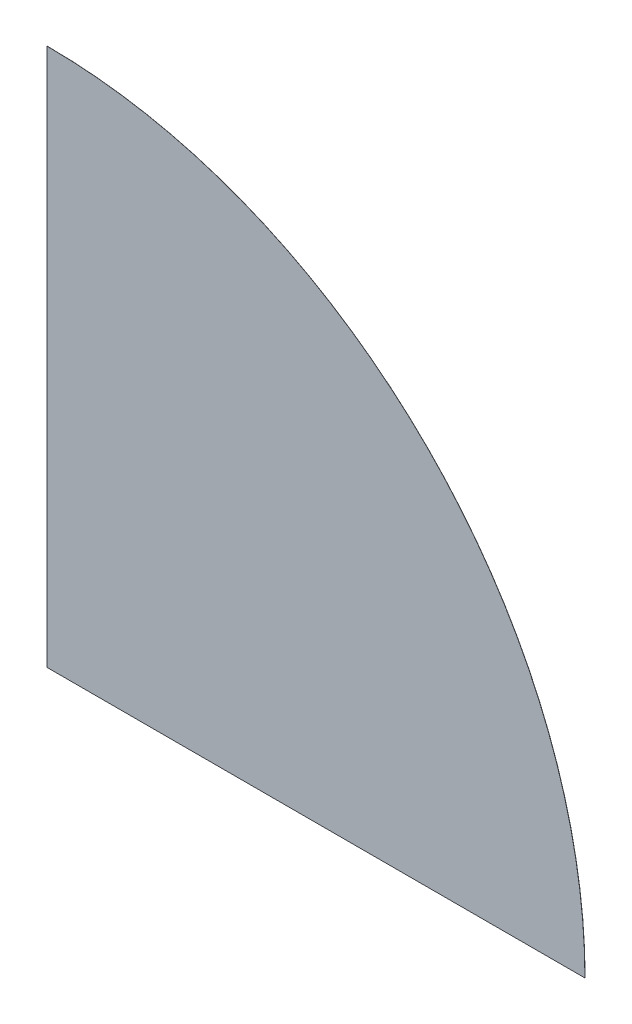
ISO-10303-21;
HEADER;
FILE_DESCRIPTION(('STEP AP214'),'2;1');
FILE_NAME('part.step','',(''),(''),'','','');
FILE_SCHEMA(('AUTOMOTIVE_DESIGN { 1 0 10303 214 1 1 1 1 }'));
ENDSEC;
DATA;
#1=APPLICATION_CONTEXT('core data for automotive mechanical design processes');
#2=APPLICATION_PROTOCOL_DEFINITION('international standard','automotive_design',2000,#1);
#3=PRODUCT_CONTEXT('',#1,'mechanical');
#4=PRODUCT('Part','Part','',(#3));
#5=PRODUCT_RELATED_PRODUCT_CATEGORY('part','',(#4));
#6=PRODUCT_DEFINITION_FORMATION('','',#4);
#7=PRODUCT_DEFINITION_CONTEXT('part definition',#1,'design');
#8=PRODUCT_DEFINITION('design','',#6,#7);
#9=PRODUCT_DEFINITION_SHAPE('','',#8);
#10=(LENGTH_UNIT() NAMED_UNIT(*) SI_UNIT(.MILLI.,.METRE.));
#11=(NAMED_UNIT(*) PLANE_ANGLE_UNIT() SI_UNIT($,.RADIAN.));
#12=(NAMED_UNIT(*) SI_UNIT($,.STERADIAN.) SOLID_ANGLE_UNIT());
#13=UNCERTAINTY_MEASURE_WITH_UNIT(LENGTH_MEASURE(1.E-05),#10,'distance_accuracy_value','');
#14=(GEOMETRIC_REPRESENTATION_CONTEXT(3) GLOBAL_UNCERTAINTY_ASSIGNED_CONTEXT((#13)) GLOBAL_UNIT_ASSIGNED_CONTEXT((#10,
#11,#12)) REPRESENTATION_CONTEXT('',''));
#15=CARTESIAN_POINT('',(0.,0.,0.));
#16=DIRECTION('',(0.,0.,1.));
#17=DIRECTION('',(1.,0.,0.));
#18=AXIS2_PLACEMENT_3D('',#15,#16,#17);
#19=CARTESIAN_POINT('',(0.,3.57,0.001));
#20=DIRECTION('',(1.,0.,0.));
#21=DIRECTION('',(0.,0.,-1.));
#22=AXIS2_PLACEMENT_3D('',#19,#20,#21);
#23=PLANE('',#22);
#24=DIRECTION('',(0.,-1.,0.));
#25=VECTOR('',#24,1.);
#26=CARTESIAN_POINT('',(0.,3.57,0.));
#27=LINE('',#26,#25);
#28=CARTESIAN_POINT('',(0.,3.57,0.));
#29=VERTEX_POINT('',#28);
#30=CARTESIAN_POINT('',(0.,0.,0.));
#31=VERTEX_POINT('',#30);
#32=EDGE_CURVE('E95',#29,#31,#27,.T.);
#33=ORIENTED_EDGE('',*,*,#32,.T.);
#34=DIRECTION('',(0.,0.,-1.));
#35=VECTOR('',#34,1.);
#36=CARTESIAN_POINT('',(0.,0.,0.001));
#37=LINE('',#36,#35);
#38=CARTESIAN_POINT('',(0.,0.,0.001));
#39=VERTEX_POINT('',#38);
#40=EDGE_CURVE('E11',#39,#31,#37,.T.);
#41=ORIENTED_EDGE('',*,*,#40,.F.);
#42=DIRECTION('',(0.,-1.,0.));
#43=VECTOR('',#42,1.);
#44=CARTESIAN_POINT('',(0.,3.57,0.001));
#45=LINE('',#44,#43);
#46=CARTESIAN_POINT('',(0.,3.57,0.001));
#47=VERTEX_POINT('',#46);
#48=EDGE_CURVE('E87',#47,#39,#45,.T.);
#49=ORIENTED_EDGE('',*,*,#48,.F.);
#50=DIRECTION('',(0.,0.,-1.));
#51=VECTOR('',#50,1.);
#52=CARTESIAN_POINT('',(0.,3.57,0.001));
#53=LINE('',#52,#51);
#54=EDGE_CURVE('E96',#47,#29,#53,.T.);
#55=ORIENTED_EDGE('',*,*,#54,.T.);
#56=EDGE_LOOP('',(#33,#41,#49,#55));
#57=FACE_BOUND('',#56,.T.);
#58=ADVANCED_FACE('F45',(#57),#23,.F.);
#59=CARTESIAN_POINT('',(0.,0.,0.001));
#60=DIRECTION('',(0.,1.,0.));
#61=DIRECTION('',(0.,0.,1.));
#62=AXIS2_PLACEMENT_3D('',#59,#60,#61);
#63=PLANE('',#62);
#64=DIRECTION('',(1.,0.,0.));
#65=VECTOR('',#64,1.);
#66=CARTESIAN_POINT('',(0.,0.,0.));
#67=LINE('',#66,#65);
#68=CARTESIAN_POINT('',(3.57,0.,0.));
#69=VERTEX_POINT('',#68);
#70=EDGE_CURVE('E74',#31,#69,#67,.T.);
#71=ORIENTED_EDGE('',*,*,#70,.T.);
#72=DIRECTION('',(0.,0.,-1.));
#73=VECTOR('',#72,1.);
#74=CARTESIAN_POINT('',(3.57,0.,0.001));
#75=LINE('',#74,#73);
#76=CARTESIAN_POINT('',(3.57,0.,0.001));
#77=VERTEX_POINT('',#76);
#78=EDGE_CURVE('E54',#77,#69,#75,.T.);
#79=ORIENTED_EDGE('',*,*,#78,.F.);
#80=DIRECTION('',(1.,0.,0.));
#81=VECTOR('',#80,1.);
#82=CARTESIAN_POINT('',(0.,0.,0.001));
#83=LINE('',#82,#81);
#84=EDGE_CURVE('E82',#39,#77,#83,.T.);
#85=ORIENTED_EDGE('',*,*,#84,.F.);
#86=ORIENTED_EDGE('',*,*,#40,.T.);
#87=EDGE_LOOP('',(#71,#79,#85,#86));
#88=FACE_BOUND('',#87,.T.);
#89=ADVANCED_FACE('F83',(#88),#63,.F.);
#90=CARTESIAN_POINT('',(0.,0.,0.001));
#91=DIRECTION('',(0.,0.,-1.));
#92=DIRECTION('',(-1.,0.,0.));
#93=AXIS2_PLACEMENT_3D('',#90,#91,#92);
#94=CYLINDRICAL_SURFACE('',#93,3.57);
#95=CARTESIAN_POINT('',(0.,0.,0.));
#96=DIRECTION('',(0.,0.,1.));
#97=DIRECTION('',(1.,0.,0.));
#98=AXIS2_PLACEMENT_3D('',#95,#96,#97);
#99=CIRCLE('',#98,3.57);
#100=EDGE_CURVE('E79',#69,#29,#99,.T.);
#101=ORIENTED_EDGE('',*,*,#100,.T.);
#102=ORIENTED_EDGE('',*,*,#54,.F.);
#103=CARTESIAN_POINT('',(0.,0.,0.001));
#104=DIRECTION('',(0.,0.,1.));
#105=DIRECTION('',(1.,0.,0.));
#106=AXIS2_PLACEMENT_3D('',#103,#104,#105);
#107=CIRCLE('',#106,3.57);
#108=EDGE_CURVE('E62',#77,#47,#107,.T.);
#109=ORIENTED_EDGE('',*,*,#108,.F.);
#110=ORIENTED_EDGE('',*,*,#78,.T.);
#111=EDGE_LOOP('',(#101,#102,#109,#110));
#112=FACE_BOUND('',#111,.T.);
#113=ADVANCED_FACE('F108',(#112),#94,.T.);
#114=CARTESIAN_POINT('',(0.,0.,0.001));
#115=DIRECTION('',(0.,0.,1.));
#116=DIRECTION('',(1.,0.,0.));
#117=AXIS2_PLACEMENT_3D('',#114,#115,#116);
#118=PLANE('',#117);
#119=ORIENTED_EDGE('',*,*,#48,.T.);
#120=ORIENTED_EDGE('',*,*,#84,.T.);
#121=ORIENTED_EDGE('',*,*,#108,.T.);
#122=EDGE_LOOP('',(#119,#120,#121));
#123=FACE_BOUND('',#122,.T.);
#124=ADVANCED_FACE('F90',(#123),#118,.T.);
#125=CARTESIAN_POINT('',(0.,0.,0.));
#126=DIRECTION('',(0.,0.,1.));
#127=DIRECTION('',(1.,0.,0.));
#128=AXIS2_PLACEMENT_3D('',#125,#126,#127);
#129=PLANE('',#128);
#130=ORIENTED_EDGE('',*,*,#32,.F.);
#131=ORIENTED_EDGE('',*,*,#100,.F.);
#132=ORIENTED_EDGE('',*,*,#70,.F.);
#133=EDGE_LOOP('',(#130,#131,#132));
#134=FACE_BOUND('',#133,.T.);
#135=ADVANCED_FACE('F109',(#134),#129,.F.);
#136=CLOSED_SHELL('',(#58,#89,#113,#124,#135));
#137=MANIFOLD_SOLID_BREP('B2',#136);
#138=ADVANCED_BREP_SHAPE_REPRESENTATION('',(#18,#137),#14);
#139=SHAPE_DEFINITION_REPRESENTATION(#9,#138);
ENDSEC;
END-ISO-10303-21;
